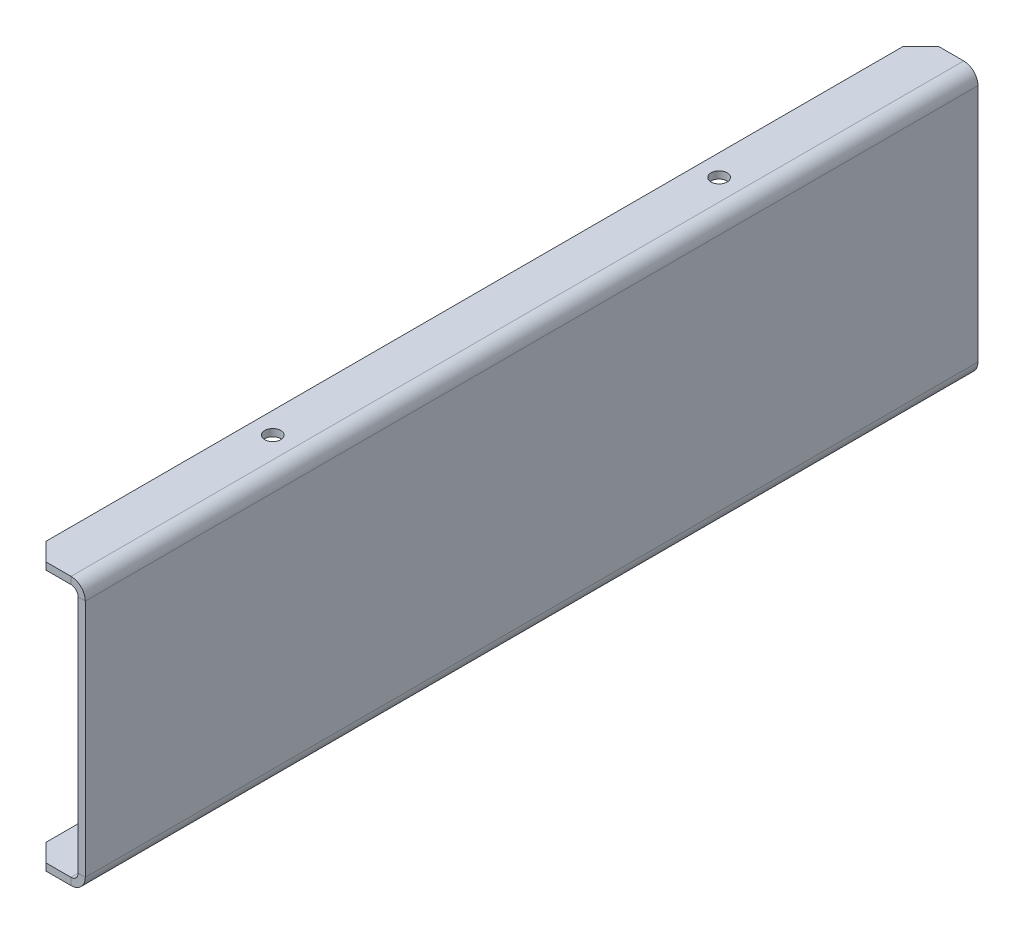
ISO-10303-21;
HEADER;
FILE_DESCRIPTION(('STEP AP214'),'2;1');
FILE_NAME('part.step','',(''),(''),'','','');
FILE_SCHEMA(('AUTOMOTIVE_DESIGN { 1 0 10303 214 1 1 1 1 }'));
ENDSEC;
DATA;
#1=APPLICATION_CONTEXT('core data for automotive mechanical design processes');
#2=APPLICATION_PROTOCOL_DEFINITION('international standard','automotive_design',2000,#1);
#3=PRODUCT_CONTEXT('',#1,'mechanical');
#4=PRODUCT('Part','Part','',(#3));
#5=PRODUCT_RELATED_PRODUCT_CATEGORY('part','',(#4));
#6=PRODUCT_DEFINITION_FORMATION('','',#4);
#7=PRODUCT_DEFINITION_CONTEXT('part definition',#1,'design');
#8=PRODUCT_DEFINITION('design','',#6,#7);
#9=PRODUCT_DEFINITION_SHAPE('','',#8);
#10=(LENGTH_UNIT() NAMED_UNIT(*) SI_UNIT(.MILLI.,.METRE.));
#11=(NAMED_UNIT(*) PLANE_ANGLE_UNIT() SI_UNIT($,.RADIAN.));
#12=(NAMED_UNIT(*) SI_UNIT($,.STERADIAN.) SOLID_ANGLE_UNIT());
#13=UNCERTAINTY_MEASURE_WITH_UNIT(LENGTH_MEASURE(1.E-05),#10,'distance_accuracy_value','');
#14=(GEOMETRIC_REPRESENTATION_CONTEXT(3) GLOBAL_UNCERTAINTY_ASSIGNED_CONTEXT((#13)) GLOBAL_UNIT_ASSIGNED_CONTEXT((#10,
#11,#12)) REPRESENTATION_CONTEXT('',''));
#15=CARTESIAN_POINT('',(0.,0.,0.));
#16=DIRECTION('',(0.,0.,1.));
#17=DIRECTION('',(1.,0.,0.));
#18=AXIS2_PLACEMENT_3D('',#15,#16,#17);
#19=CARTESIAN_POINT('',(0.,33.5,250.));
#20=DIRECTION('',(0.,0.,1.));
#21=DIRECTION('',(1.,0.,0.));
#22=AXIS2_PLACEMENT_3D('',#19,#20,#21);
#23=PLANE('',#22);
#24=DIRECTION('',(-1.,0.,0.));
#25=VECTOR('',#24,1.);
#26=CARTESIAN_POINT('',(0.,33.5,250.));
#27=LINE('',#26,#25);
#28=CARTESIAN_POINT('',(0.,33.5,250.));
#29=VERTEX_POINT('',#28);
#30=CARTESIAN_POINT('',(-1.99999999999999,33.5,250.));
#31=VERTEX_POINT('',#30);
#32=EDGE_CURVE('E271',#29,#31,#27,.T.);
#33=ORIENTED_EDGE('',*,*,#32,.F.);
#34=CARTESIAN_POINT('',(-3.99999999999999,33.5,250.));
#35=DIRECTION('',(0.,0.,1.));
#36=DIRECTION('',(1.,0.,0.));
#37=AXIS2_PLACEMENT_3D('',#34,#35,#36);
#38=CIRCLE('',#37,4.);
#39=CARTESIAN_POINT('',(-3.99999999999999,37.5,250.));
#40=VERTEX_POINT('',#39);
#41=EDGE_CURVE('E189',#40,#29,#38,.F.);
#42=ORIENTED_EDGE('',*,*,#41,.F.);
#43=DIRECTION('',(0.,1.,0.));
#44=VECTOR('',#43,1.);
#45=CARTESIAN_POINT('',(-3.99999999999999,35.5,250.));
#46=LINE('',#45,#44);
#47=CARTESIAN_POINT('',(-3.99999999999999,35.5,250.));
#48=VERTEX_POINT('',#47);
#49=EDGE_CURVE('E268',#48,#40,#46,.T.);
#50=ORIENTED_EDGE('',*,*,#49,.F.);
#51=CARTESIAN_POINT('',(-3.99999999999999,33.5,250.));
#52=DIRECTION('',(0.,0.,1.));
#53=DIRECTION('',(1.,0.,0.));
#54=AXIS2_PLACEMENT_3D('',#51,#52,#53);
#55=CIRCLE('',#54,2.);
#56=EDGE_CURVE('E199',#48,#31,#55,.F.);
#57=ORIENTED_EDGE('',*,*,#56,.T.);
#58=EDGE_LOOP('',(#33,#42,#50,#57));
#59=FACE_BOUND('',#58,.T.);
#60=ADVANCED_FACE('F34',(#59),#23,.T.);
#61=CARTESIAN_POINT('',(-3.99999999999999,35.5,250.));
#62=DIRECTION('',(0.,0.,1.));
#63=DIRECTION('',(1.,0.,0.));
#64=AXIS2_PLACEMENT_3D('',#61,#62,#63);
#65=PLANE('',#64);
#66=DIRECTION('',(0.,-1.,0.));
#67=VECTOR('',#66,1.);
#68=CARTESIAN_POINT('',(0.,37.5,250.));
#69=LINE('',#68,#67);
#70=CARTESIAN_POINT('',(0.,-33.5,250.));
#71=VERTEX_POINT('',#70);
#72=EDGE_CURVE('E187',#29,#71,#69,.T.);
#73=ORIENTED_EDGE('',*,*,#72,.F.);
#74=ORIENTED_EDGE('',*,*,#32,.T.);
#75=DIRECTION('',(0.,1.,0.));
#76=VECTOR('',#75,1.);
#77=CARTESIAN_POINT('',(-1.99999999999999,37.5,250.));
#78=LINE('',#77,#76);
#79=CARTESIAN_POINT('',(-1.99999999999999,-33.5,250.));
#80=VERTEX_POINT('',#79);
#81=EDGE_CURVE('E202',#31,#80,#78,.F.);
#82=ORIENTED_EDGE('',*,*,#81,.T.);
#83=DIRECTION('',(1.,0.,0.));
#84=VECTOR('',#83,1.);
#85=CARTESIAN_POINT('',(-1.99999999999999,-33.5,250.));
#86=LINE('',#85,#84);
#87=EDGE_CURVE('E161',#80,#71,#86,.T.);
#88=ORIENTED_EDGE('',*,*,#87,.T.);
#89=EDGE_LOOP('',(#73,#74,#82,#88));
#90=FACE_BOUND('',#89,.T.);
#91=ADVANCED_FACE('F338',(#90),#65,.T.);
#92=CARTESIAN_POINT('',(-3.99999999999999,37.5,0.));
#93=DIRECTION('',(0.,0.,-1.));
#94=DIRECTION('',(-1.,0.,0.));
#95=AXIS2_PLACEMENT_3D('',#92,#93,#94);
#96=PLANE('',#95);
#97=DIRECTION('',(0.,-1.,0.));
#98=VECTOR('',#97,1.);
#99=CARTESIAN_POINT('',(-3.99999999999999,37.5,0.));
#100=LINE('',#99,#98);
#101=CARTESIAN_POINT('',(-3.99999999999999,37.5,0.));
#102=VERTEX_POINT('',#101);
#103=CARTESIAN_POINT('',(-3.99999999999999,35.5,0.));
#104=VERTEX_POINT('',#103);
#105=EDGE_CURVE('E265',#102,#104,#100,.T.);
#106=ORIENTED_EDGE('',*,*,#105,.F.);
#107=CARTESIAN_POINT('',(-3.99999999999999,33.5,0.));
#108=DIRECTION('',(0.,0.,1.));
#109=DIRECTION('',(1.,0.,0.));
#110=AXIS2_PLACEMENT_3D('',#107,#108,#109);
#111=CIRCLE('',#110,4.);
#112=CARTESIAN_POINT('',(0.,33.5,0.));
#113=VERTEX_POINT('',#112);
#114=EDGE_CURVE('E217',#102,#113,#111,.F.);
#115=ORIENTED_EDGE('',*,*,#114,.T.);
#116=DIRECTION('',(1.,0.,0.));
#117=VECTOR('',#116,1.);
#118=CARTESIAN_POINT('',(-1.99999999999999,33.5,0.));
#119=LINE('',#118,#117);
#120=CARTESIAN_POINT('',(-1.99999999999999,33.5,0.));
#121=VERTEX_POINT('',#120);
#122=EDGE_CURVE('E160',#121,#113,#119,.T.);
#123=ORIENTED_EDGE('',*,*,#122,.F.);
#124=CARTESIAN_POINT('',(-3.99999999999999,33.5,0.));
#125=DIRECTION('',(0.,0.,1.));
#126=DIRECTION('',(1.,0.,0.));
#127=AXIS2_PLACEMENT_3D('',#124,#125,#126);
#128=CIRCLE('',#127,2.);
#129=EDGE_CURVE('E224',#104,#121,#128,.F.);
#130=ORIENTED_EDGE('',*,*,#129,.F.);
#131=EDGE_LOOP('',(#106,#115,#123,#130));
#132=FACE_BOUND('',#131,.T.);
#133=ADVANCED_FACE('F423',(#132),#96,.T.);
#134=CARTESIAN_POINT('',(-1.99999999999999,33.5,0.));
#135=DIRECTION('',(0.,0.,-1.));
#136=DIRECTION('',(-1.,0.,0.));
#137=AXIS2_PLACEMENT_3D('',#134,#135,#136);
#138=PLANE('',#137);
#139=DIRECTION('',(1.,0.,0.));
#140=VECTOR('',#139,1.);
#141=CARTESIAN_POINT('',(0.,35.5,0.));
#142=LINE('',#141,#140);
#143=CARTESIAN_POINT('',(-11.,35.5,0.));
#144=VERTEX_POINT('',#143);
#145=EDGE_CURVE('E222',#144,#104,#142,.T.);
#146=ORIENTED_EDGE('',*,*,#145,.F.);
#147=DIRECTION('',(0.,1.,0.));
#148=VECTOR('',#147,1.);
#149=CARTESIAN_POINT('',(-11.,33.5,0.));
#150=LINE('',#149,#148);
#151=CARTESIAN_POINT('',(-11.,37.5,0.));
#152=VERTEX_POINT('',#151);
#153=EDGE_CURVE('E289',#144,#152,#150,.T.);
#154=ORIENTED_EDGE('',*,*,#153,.T.);
#155=DIRECTION('',(1.,0.,0.));
#156=VECTOR('',#155,1.);
#157=CARTESIAN_POINT('',(0.,37.5,0.));
#158=LINE('',#157,#156);
#159=EDGE_CURVE('E220',#152,#102,#158,.T.);
#160=ORIENTED_EDGE('',*,*,#159,.T.);
#161=ORIENTED_EDGE('',*,*,#105,.T.);
#162=EDGE_LOOP('',(#146,#154,#160,#161));
#163=FACE_BOUND('',#162,.T.);
#164=ADVANCED_FACE('F311',(#163),#138,.T.);
#165=CARTESIAN_POINT('',(-3.99999999999999,-37.5,250.));
#166=DIRECTION('',(0.,0.,1.));
#167=DIRECTION('',(1.,0.,0.));
#168=AXIS2_PLACEMENT_3D('',#165,#166,#167);
#169=PLANE('',#168);
#170=DIRECTION('',(0.,1.,0.));
#171=VECTOR('',#170,1.);
#172=CARTESIAN_POINT('',(-3.99999999999999,-37.5,250.));
#173=LINE('',#172,#171);
#174=CARTESIAN_POINT('',(-3.99999999999999,-37.5,250.));
#175=VERTEX_POINT('',#174);
#176=CARTESIAN_POINT('',(-3.99999999999999,-35.5,250.));
#177=VERTEX_POINT('',#176);
#178=EDGE_CURVE('E148',#175,#177,#173,.T.);
#179=ORIENTED_EDGE('',*,*,#178,.F.);
#180=CARTESIAN_POINT('',(-3.99999999999999,-33.5,250.));
#181=DIRECTION('',(0.,0.,1.));
#182=DIRECTION('',(1.,0.,0.));
#183=AXIS2_PLACEMENT_3D('',#180,#181,#182);
#184=CIRCLE('',#183,4.);
#185=EDGE_CURVE('E152',#71,#175,#184,.F.);
#186=ORIENTED_EDGE('',*,*,#185,.F.);
#187=ORIENTED_EDGE('',*,*,#87,.F.);
#188=CARTESIAN_POINT('',(-3.99999999999999,-33.5,250.));
#189=DIRECTION('',(0.,0.,1.));
#190=DIRECTION('',(1.,0.,0.));
#191=AXIS2_PLACEMENT_3D('',#188,#189,#190);
#192=CIRCLE('',#191,2.);
#193=EDGE_CURVE('E155',#80,#177,#192,.F.);
#194=ORIENTED_EDGE('',*,*,#193,.T.);
#195=EDGE_LOOP('',(#179,#186,#187,#194));
#196=FACE_BOUND('',#195,.T.);
#197=ADVANCED_FACE('F150',(#196),#169,.T.);
#198=CARTESIAN_POINT('',(-1.99999999999999,-33.5,250.));
#199=DIRECTION('',(0.,0.,1.));
#200=DIRECTION('',(1.,0.,0.));
#201=AXIS2_PLACEMENT_3D('',#198,#199,#200);
#202=PLANE('',#201);
#203=DIRECTION('',(-1.,0.,0.));
#204=VECTOR('',#203,1.);
#205=CARTESIAN_POINT('',(0.,-35.5,250.));
#206=LINE('',#205,#204);
#207=CARTESIAN_POINT('',(-11.,-35.5,250.));
#208=VERTEX_POINT('',#207);
#209=EDGE_CURVE('E182',#177,#208,#206,.T.);
#210=ORIENTED_EDGE('',*,*,#209,.T.);
#211=DIRECTION('',(0.,-1.,0.));
#212=VECTOR('',#211,1.);
#213=CARTESIAN_POINT('',(-11.,-33.5,250.));
#214=LINE('',#213,#212);
#215=CARTESIAN_POINT('',(-11.,-37.5,250.));
#216=VERTEX_POINT('',#215);
#217=EDGE_CURVE('E42',#208,#216,#214,.T.);
#218=ORIENTED_EDGE('',*,*,#217,.T.);
#219=DIRECTION('',(-1.,0.,0.));
#220=VECTOR('',#219,1.);
#221=CARTESIAN_POINT('',(0.,-37.5,250.));
#222=LINE('',#221,#220);
#223=EDGE_CURVE('E170',#175,#216,#222,.T.);
#224=ORIENTED_EDGE('',*,*,#223,.F.);
#225=ORIENTED_EDGE('',*,*,#178,.T.);
#226=EDGE_LOOP('',(#210,#218,#224,#225));
#227=FACE_BOUND('',#226,.T.);
#228=ADVANCED_FACE('F180',(#227),#202,.T.);
#229=CARTESIAN_POINT('',(0.,-33.5,0.));
#230=DIRECTION('',(0.,0.,-1.));
#231=DIRECTION('',(-1.,0.,0.));
#232=AXIS2_PLACEMENT_3D('',#229,#230,#231);
#233=PLANE('',#232);
#234=DIRECTION('',(-1.,0.,0.));
#235=VECTOR('',#234,1.);
#236=CARTESIAN_POINT('',(0.,-33.5,0.));
#237=LINE('',#236,#235);
#238=CARTESIAN_POINT('',(0.,-33.5,0.));
#239=VERTEX_POINT('',#238);
#240=CARTESIAN_POINT('',(-1.99999999999999,-33.5,0.));
#241=VERTEX_POINT('',#240);
#242=EDGE_CURVE('E261',#239,#241,#237,.T.);
#243=ORIENTED_EDGE('',*,*,#242,.F.);
#244=CARTESIAN_POINT('',(-3.99999999999999,-33.5,0.));
#245=DIRECTION('',(0.,0.,1.));
#246=DIRECTION('',(1.,0.,0.));
#247=AXIS2_PLACEMENT_3D('',#244,#245,#246);
#248=CIRCLE('',#247,4.);
#249=CARTESIAN_POINT('',(-3.99999999999999,-37.5,0.));
#250=VERTEX_POINT('',#249);
#251=EDGE_CURVE('E212',#239,#250,#248,.F.);
#252=ORIENTED_EDGE('',*,*,#251,.T.);
#253=DIRECTION('',(0.,-1.,0.));
#254=VECTOR('',#253,1.);
#255=CARTESIAN_POINT('',(-3.99999999999999,-35.5,0.));
#256=LINE('',#255,#254);
#257=CARTESIAN_POINT('',(-3.99999999999999,-35.5,0.));
#258=VERTEX_POINT('',#257);
#259=EDGE_CURVE('E259',#258,#250,#256,.T.);
#260=ORIENTED_EDGE('',*,*,#259,.F.);
#261=CARTESIAN_POINT('',(-3.99999999999999,-33.5,0.));
#262=DIRECTION('',(0.,0.,1.));
#263=DIRECTION('',(1.,0.,0.));
#264=AXIS2_PLACEMENT_3D('',#261,#262,#263);
#265=CIRCLE('',#264,2.);
#266=EDGE_CURVE('E230',#241,#258,#265,.F.);
#267=ORIENTED_EDGE('',*,*,#266,.F.);
#268=EDGE_LOOP('',(#243,#252,#260,#267));
#269=FACE_BOUND('',#268,.T.);
#270=ADVANCED_FACE('F447',(#269),#233,.T.);
#271=CARTESIAN_POINT('',(-3.99999999999999,-35.5,0.));
#272=DIRECTION('',(0.,0.,-1.));
#273=DIRECTION('',(-1.,0.,0.));
#274=AXIS2_PLACEMENT_3D('',#271,#272,#273);
#275=PLANE('',#274);
#276=DIRECTION('',(0.,-1.,0.));
#277=VECTOR('',#276,1.);
#278=CARTESIAN_POINT('',(0.,37.5,0.));
#279=LINE('',#278,#277);
#280=EDGE_CURVE('E214',#113,#239,#279,.T.);
#281=ORIENTED_EDGE('',*,*,#280,.T.);
#282=ORIENTED_EDGE('',*,*,#242,.T.);
#283=DIRECTION('',(0.,1.,0.));
#284=VECTOR('',#283,1.);
#285=CARTESIAN_POINT('',(-1.99999999999999,37.5,0.));
#286=LINE('',#285,#284);
#287=EDGE_CURVE('E227',#121,#241,#286,.F.);
#288=ORIENTED_EDGE('',*,*,#287,.F.);
#289=ORIENTED_EDGE('',*,*,#122,.T.);
#290=EDGE_LOOP('',(#281,#282,#288,#289));
#291=FACE_BOUND('',#290,.T.);
#292=ADVANCED_FACE('F394',(#291),#275,.T.);
#293=CARTESIAN_POINT('',(0.,-35.5,250.));
#294=DIRECTION('',(0.,-1.,0.));
#295=DIRECTION('',(1.,0.,0.));
#296=AXIS2_PLACEMENT_3D('',#293,#294,#295);
#297=PLANE('',#296);
#298=CARTESIAN_POINT('',(-10.,-35.5,218.75));
#299=DIRECTION('',(0.,-1.,0.));
#300=DIRECTION('',(1.,0.,0.));
#301=AXIS2_PLACEMENT_3D('',#298,#299,#300);
#302=CIRCLE('',#301,2.25);
#303=CARTESIAN_POINT('',(-7.75,-35.5,218.75));
#304=VERTEX_POINT('',#303);
#305=EDGE_CURVE('E380',#304,#304,#302,.F.);
#306=ORIENTED_EDGE('',*,*,#305,.F.);
#307=EDGE_LOOP('',(#306));
#308=FACE_BOUND('',#307,.T.);
#309=CARTESIAN_POINT('',(-9.99999999999998,-35.5,156.25));
#310=DIRECTION('',(0.,-1.,0.));
#311=DIRECTION('',(1.,0.,0.));
#312=AXIS2_PLACEMENT_3D('',#309,#310,#311);
#313=CIRCLE('',#312,2.25);
#314=CARTESIAN_POINT('',(-7.74999999999998,-35.5,156.25));
#315=VERTEX_POINT('',#314);
#316=EDGE_CURVE('E374',#315,#315,#313,.F.);
#317=ORIENTED_EDGE('',*,*,#316,.F.);
#318=EDGE_LOOP('',(#317));
#319=FACE_BOUND('',#318,.T.);
#320=CARTESIAN_POINT('',(-9.99999999999997,-35.5,93.75));
#321=DIRECTION('',(0.,-1.,0.));
#322=DIRECTION('',(1.,0.,0.));
#323=AXIS2_PLACEMENT_3D('',#320,#321,#322);
#324=CIRCLE('',#323,2.25);
#325=CARTESIAN_POINT('',(-7.74999999999996,-35.5,93.75));
#326=VERTEX_POINT('',#325);
#327=EDGE_CURVE('E368',#326,#326,#324,.F.);
#328=ORIENTED_EDGE('',*,*,#327,.F.);
#329=EDGE_LOOP('',(#328));
#330=FACE_BOUND('',#329,.T.);
#331=CARTESIAN_POINT('',(-9.99999999999995,-35.5,31.25));
#332=DIRECTION('',(0.,-1.,0.));
#333=DIRECTION('',(1.,0.,0.));
#334=AXIS2_PLACEMENT_3D('',#331,#332,#333);
#335=CIRCLE('',#334,2.25);
#336=CARTESIAN_POINT('',(-7.74999999999995,-35.5,31.25));
#337=VERTEX_POINT('',#336);
#338=EDGE_CURVE('E364',#337,#337,#335,.F.);
#339=ORIENTED_EDGE('',*,*,#338,.F.);
#340=EDGE_LOOP('',(#339));
#341=FACE_BOUND('',#340,.T.);
#342=DIRECTION('',(-1.,0.,0.));
#343=VECTOR('',#342,1.);
#344=CARTESIAN_POINT('',(0.,-35.5,0.));
#345=LINE('',#344,#343);
#346=CARTESIAN_POINT('',(-11.,-35.5,0.));
#347=VERTEX_POINT('',#346);
#348=EDGE_CURVE('E207',#258,#347,#345,.T.);
#349=ORIENTED_EDGE('',*,*,#348,.T.);
#350=DIRECTION('',(-0.707106781186546,0.,0.707106781186549));
#351=VECTOR('',#350,1.);
#352=CARTESIAN_POINT('',(-11.,-35.5,0.));
#353=LINE('',#352,#351);
#354=CARTESIAN_POINT('',(-16.,-35.5,5.));
#355=VERTEX_POINT('',#354);
#356=EDGE_CURVE('E278',#347,#355,#353,.T.);
#357=ORIENTED_EDGE('',*,*,#356,.T.);
#358=DIRECTION('',(0.,0.,-1.));
#359=VECTOR('',#358,1.);
#360=CARTESIAN_POINT('',(-16.,-35.5,250.));
#361=LINE('',#360,#359);
#362=CARTESIAN_POINT('',(-16.,-35.5,245.));
#363=VERTEX_POINT('',#362);
#364=EDGE_CURVE('E256',#363,#355,#361,.T.);
#365=ORIENTED_EDGE('',*,*,#364,.F.);
#366=DIRECTION('',(-0.707106781186551,0.,-0.707106781186544));
#367=VECTOR('',#366,1.);
#368=CARTESIAN_POINT('',(-16.,-35.5,245.));
#369=LINE('',#368,#367);
#370=EDGE_CURVE('E276',#363,#208,#369,.F.);
#371=ORIENTED_EDGE('',*,*,#370,.T.);
#372=ORIENTED_EDGE('',*,*,#209,.F.);
#373=DIRECTION('',(0.,0.,-1.));
#374=VECTOR('',#373,1.);
#375=CARTESIAN_POINT('',(-3.99999999999999,-35.5,250.));
#376=LINE('',#375,#374);
#377=EDGE_CURVE('E206',#177,#258,#376,.T.);
#378=ORIENTED_EDGE('',*,*,#377,.T.);
#379=EDGE_LOOP('',(#349,#357,#365,#371,#372,#378));
#380=FACE_BOUND('',#379,.T.);
#381=ADVANCED_FACE('F350',(#308,#319,#330,#341,#380),#297,.F.);
#382=CARTESIAN_POINT('',(-16.,-37.5,250.));
#383=DIRECTION('',(-1.,0.,0.));
#384=DIRECTION('',(0.,-1.,0.));
#385=AXIS2_PLACEMENT_3D('',#382,#383,#384);
#386=PLANE('',#385);
#387=ORIENTED_EDGE('',*,*,#364,.T.);
#388=DIRECTION('',(0.,-1.,0.));
#389=VECTOR('',#388,1.);
#390=CARTESIAN_POINT('',(-16.,-37.5,5.));
#391=LINE('',#390,#389);
#392=CARTESIAN_POINT('',(-16.,-37.5,5.00000000000001));
#393=VERTEX_POINT('',#392);
#394=EDGE_CURVE('E283',#355,#393,#391,.T.);
#395=ORIENTED_EDGE('',*,*,#394,.T.);
#396=DIRECTION('',(0.,0.,-1.));
#397=VECTOR('',#396,1.);
#398=CARTESIAN_POINT('',(-16.,-37.5,250.));
#399=LINE('',#398,#397);
#400=CARTESIAN_POINT('',(-16.,-37.5,245.));
#401=VERTEX_POINT('',#400);
#402=EDGE_CURVE('E177',#401,#393,#399,.T.);
#403=ORIENTED_EDGE('',*,*,#402,.F.);
#404=DIRECTION('',(0.,1.,0.));
#405=VECTOR('',#404,1.);
#406=CARTESIAN_POINT('',(-16.,-37.5,245.));
#407=LINE('',#406,#405);
#408=EDGE_CURVE('E280',#401,#363,#407,.T.);
#409=ORIENTED_EDGE('',*,*,#408,.T.);
#410=EDGE_LOOP('',(#387,#395,#403,#409));
#411=FACE_BOUND('',#410,.T.);
#412=ADVANCED_FACE('F393',(#411),#386,.T.);
#413=CARTESIAN_POINT('',(0.,-37.5,250.));
#414=DIRECTION('',(0.,-1.,0.));
#415=DIRECTION('',(1.,0.,0.));
#416=AXIS2_PLACEMENT_3D('',#413,#414,#415);
#417=PLANE('',#416);
#418=CARTESIAN_POINT('',(-10.,-37.5,218.75));
#419=DIRECTION('',(0.,-1.,0.));
#420=DIRECTION('',(0.,0.,-1.));
#421=AXIS2_PLACEMENT_3D('',#418,#419,#420);
#422=CIRCLE('',#421,2.25);
#423=CARTESIAN_POINT('',(-10.,-37.5,216.5));
#424=VERTEX_POINT('',#423);
#425=EDGE_CURVE('E383',#424,#424,#422,.T.);
#426=ORIENTED_EDGE('',*,*,#425,.F.);
#427=EDGE_LOOP('',(#426));
#428=FACE_BOUND('',#427,.T.);
#429=CARTESIAN_POINT('',(-9.99999999999998,-37.5,156.25));
#430=DIRECTION('',(0.,-1.,0.));
#431=DIRECTION('',(0.,0.,-1.));
#432=AXIS2_PLACEMENT_3D('',#429,#430,#431);
#433=CIRCLE('',#432,2.25);
#434=CARTESIAN_POINT('',(-9.99999999999998,-37.5,154.));
#435=VERTEX_POINT('',#434);
#436=EDGE_CURVE('E377',#435,#435,#433,.T.);
#437=ORIENTED_EDGE('',*,*,#436,.F.);
#438=EDGE_LOOP('',(#437));
#439=FACE_BOUND('',#438,.T.);
#440=CARTESIAN_POINT('',(-9.99999999999997,-37.5,93.75));
#441=DIRECTION('',(0.,-1.,0.));
#442=DIRECTION('',(0.,0.,-1.));
#443=AXIS2_PLACEMENT_3D('',#440,#441,#442);
#444=CIRCLE('',#443,2.25);
#445=CARTESIAN_POINT('',(-9.99999999999997,-37.5,91.5));
#446=VERTEX_POINT('',#445);
#447=EDGE_CURVE('E371',#446,#446,#444,.T.);
#448=ORIENTED_EDGE('',*,*,#447,.F.);
#449=EDGE_LOOP('',(#448));
#450=FACE_BOUND('',#449,.T.);
#451=CARTESIAN_POINT('',(-9.99999999999995,-37.5,31.25));
#452=DIRECTION('',(0.,-1.,0.));
#453=DIRECTION('',(0.,0.,-1.));
#454=AXIS2_PLACEMENT_3D('',#451,#452,#453);
#455=CIRCLE('',#454,2.25);
#456=CARTESIAN_POINT('',(-9.99999999999995,-37.5,29.));
#457=VERTEX_POINT('',#456);
#458=EDGE_CURVE('E365',#457,#457,#455,.T.);
#459=ORIENTED_EDGE('',*,*,#458,.F.);
#460=EDGE_LOOP('',(#459));
#461=FACE_BOUND('',#460,.T.);
#462=ORIENTED_EDGE('',*,*,#402,.T.);
#463=DIRECTION('',(0.707106781186546,0.,-0.707106781186549));
#464=VECTOR('',#463,1.);
#465=CARTESIAN_POINT('',(-130.5,-37.5000000000001,119.500000000001));
#466=LINE('',#465,#464);
#467=CARTESIAN_POINT('',(-11.,-37.5,0.));
#468=VERTEX_POINT('',#467);
#469=EDGE_CURVE('E287',#393,#468,#466,.T.);
#470=ORIENTED_EDGE('',*,*,#469,.T.);
#471=DIRECTION('',(-1.,0.,0.));
#472=VECTOR('',#471,1.);
#473=CARTESIAN_POINT('',(0.,-37.5,0.));
#474=LINE('',#473,#472);
#475=EDGE_CURVE('E173',#250,#468,#474,.T.);
#476=ORIENTED_EDGE('',*,*,#475,.F.);
#477=DIRECTION('',(0.,0.,-1.));
#478=VECTOR('',#477,1.);
#479=CARTESIAN_POINT('',(-3.99999999999999,-37.5,250.));
#480=LINE('',#479,#478);
#481=EDGE_CURVE('E167',#175,#250,#480,.T.);
#482=ORIENTED_EDGE('',*,*,#481,.F.);
#483=ORIENTED_EDGE('',*,*,#223,.T.);
#484=DIRECTION('',(0.707106781186551,0.,0.707106781186544));
#485=VECTOR('',#484,1.);
#486=CARTESIAN_POINT('',(-5.49999999999993,-37.5,255.5));
#487=LINE('',#486,#485);
#488=EDGE_CURVE('E285',#216,#401,#487,.F.);
#489=ORIENTED_EDGE('',*,*,#488,.T.);
#490=EDGE_LOOP('',(#462,#470,#476,#482,#483,#489));
#491=FACE_BOUND('',#490,.T.);
#492=ADVANCED_FACE('F169',(#428,#439,#450,#461,#491),#417,.T.);
#493=CARTESIAN_POINT('',(-3.99999999999999,-33.5,250.));
#494=DIRECTION('',(0.,0.,-1.));
#495=DIRECTION('',(-1.,0.,0.));
#496=AXIS2_PLACEMENT_3D('',#493,#494,#495);
#497=CYLINDRICAL_SURFACE('',#496,4.);
#498=ORIENTED_EDGE('',*,*,#251,.F.);
#499=DIRECTION('',(0.,0.,-1.));
#500=VECTOR('',#499,1.);
#501=CARTESIAN_POINT('',(0.,-33.5,250.));
#502=LINE('',#501,#500);
#503=EDGE_CURVE('E178',#71,#239,#502,.T.);
#504=ORIENTED_EDGE('',*,*,#503,.F.);
#505=ORIENTED_EDGE('',*,*,#185,.T.);
#506=ORIENTED_EDGE('',*,*,#481,.T.);
#507=EDGE_LOOP('',(#498,#504,#505,#506));
#508=FACE_BOUND('',#507,.T.);
#509=ADVANCED_FACE('F185',(#508),#497,.T.);
#510=CARTESIAN_POINT('',(0.,37.5,250.));
#511=DIRECTION('',(1.,0.,0.));
#512=DIRECTION('',(0.,0.,-1.));
#513=AXIS2_PLACEMENT_3D('',#510,#511,#512);
#514=PLANE('',#513);
#515=ORIENTED_EDGE('',*,*,#280,.F.);
#516=DIRECTION('',(0.,0.,-1.));
#517=VECTOR('',#516,1.);
#518=CARTESIAN_POINT('',(0.,33.5,250.));
#519=LINE('',#518,#517);
#520=EDGE_CURVE('E251',#29,#113,#519,.T.);
#521=ORIENTED_EDGE('',*,*,#520,.F.);
#522=ORIENTED_EDGE('',*,*,#72,.T.);
#523=ORIENTED_EDGE('',*,*,#503,.T.);
#524=EDGE_LOOP('',(#515,#521,#522,#523));
#525=FACE_BOUND('',#524,.T.);
#526=ADVANCED_FACE('F337',(#525),#514,.T.);
#527=CARTESIAN_POINT('',(-3.99999999999999,33.5,250.));
#528=DIRECTION('',(0.,0.,-1.));
#529=DIRECTION('',(-1.,0.,0.));
#530=AXIS2_PLACEMENT_3D('',#527,#528,#529);
#531=CYLINDRICAL_SURFACE('',#530,4.);
#532=ORIENTED_EDGE('',*,*,#114,.F.);
#533=DIRECTION('',(0.,0.,-1.));
#534=VECTOR('',#533,1.);
#535=CARTESIAN_POINT('',(-3.99999999999999,37.5,250.));
#536=LINE('',#535,#534);
#537=EDGE_CURVE('E248',#40,#102,#536,.T.);
#538=ORIENTED_EDGE('',*,*,#537,.F.);
#539=ORIENTED_EDGE('',*,*,#41,.T.);
#540=ORIENTED_EDGE('',*,*,#520,.T.);
#541=EDGE_LOOP('',(#532,#538,#539,#540));
#542=FACE_BOUND('',#541,.T.);
#543=ADVANCED_FACE('F329',(#542),#531,.T.);
#544=CARTESIAN_POINT('',(0.,37.5,250.));
#545=DIRECTION('',(0.,1.,0.));
#546=DIRECTION('',(-1.,0.,0.));
#547=AXIS2_PLACEMENT_3D('',#544,#545,#546);
#548=PLANE('',#547);
#549=CARTESIAN_POINT('',(-9.99999999999969,37.5,187.5));
#550=DIRECTION('',(0.,1.,0.));
#551=DIRECTION('',(0.,0.,-1.));
#552=AXIS2_PLACEMENT_3D('',#549,#550,#551);
#553=CIRCLE('',#552,2.25);
#554=CARTESIAN_POINT('',(-9.99999999999969,37.5,185.25));
#555=VERTEX_POINT('',#554);
#556=EDGE_CURVE('E361',#555,#555,#553,.T.);
#557=ORIENTED_EDGE('',*,*,#556,.F.);
#558=EDGE_LOOP('',(#557));
#559=FACE_BOUND('',#558,.T.);
#560=CARTESIAN_POINT('',(-9.99999999999998,37.5,62.5));
#561=DIRECTION('',(0.,1.,0.));
#562=DIRECTION('',(0.,0.,1.));
#563=AXIS2_PLACEMENT_3D('',#560,#561,#562);
#564=CIRCLE('',#563,2.25);
#565=CARTESIAN_POINT('',(-9.99999999999998,37.5,64.75));
#566=VERTEX_POINT('',#565);
#567=EDGE_CURVE('E355',#566,#566,#564,.T.);
#568=ORIENTED_EDGE('',*,*,#567,.F.);
#569=EDGE_LOOP('',(#568));
#570=FACE_BOUND('',#569,.T.);
#571=ORIENTED_EDGE('',*,*,#159,.F.);
#572=DIRECTION('',(0.707106781186546,0.,-0.707106781186549));
#573=VECTOR('',#572,1.);
#574=CARTESIAN_POINT('',(-130.5,37.5000000000001,119.500000000001));
#575=LINE('',#574,#573);
#576=CARTESIAN_POINT('',(-16.,37.5,5.));
#577=VERTEX_POINT('',#576);
#578=EDGE_CURVE('E294',#152,#577,#575,.F.);
#579=ORIENTED_EDGE('',*,*,#578,.T.);
#580=DIRECTION('',(0.,0.,-1.));
#581=VECTOR('',#580,1.);
#582=CARTESIAN_POINT('',(-16.,37.5,250.));
#583=LINE('',#582,#581);
#584=CARTESIAN_POINT('',(-16.,37.5,245.));
#585=VERTEX_POINT('',#584);
#586=EDGE_CURVE('E246',#585,#577,#583,.T.);
#587=ORIENTED_EDGE('',*,*,#586,.F.);
#588=DIRECTION('',(-0.707106781186551,0.,-0.707106781186544));
#589=VECTOR('',#588,1.);
#590=CARTESIAN_POINT('',(-5.49999999999993,37.5,255.5));
#591=LINE('',#590,#589);
#592=CARTESIAN_POINT('',(-11.,37.5,250.));
#593=VERTEX_POINT('',#592);
#594=EDGE_CURVE('E292',#585,#593,#591,.F.);
#595=ORIENTED_EDGE('',*,*,#594,.T.);
#596=DIRECTION('',(1.,0.,0.));
#597=VECTOR('',#596,1.);
#598=CARTESIAN_POINT('',(0.,37.5,250.));
#599=LINE('',#598,#597);
#600=EDGE_CURVE('E195',#593,#40,#599,.T.);
#601=ORIENTED_EDGE('',*,*,#600,.T.);
#602=ORIENTED_EDGE('',*,*,#537,.T.);
#603=EDGE_LOOP('',(#571,#579,#587,#595,#601,#602));
#604=FACE_BOUND('',#603,.T.);
#605=ADVANCED_FACE('F317',(#559,#570,#604),#548,.T.);
#606=CARTESIAN_POINT('',(-16.,35.5,250.));
#607=DIRECTION('',(-1.,0.,0.));
#608=DIRECTION('',(0.,-1.,0.));
#609=AXIS2_PLACEMENT_3D('',#606,#607,#608);
#610=PLANE('',#609);
#611=ORIENTED_EDGE('',*,*,#586,.T.);
#612=DIRECTION('',(0.,-1.,0.));
#613=VECTOR('',#612,1.);
#614=CARTESIAN_POINT('',(-16.,35.5,5.));
#615=LINE('',#614,#613);
#616=CARTESIAN_POINT('',(-16.,35.5,4.99999999999998));
#617=VERTEX_POINT('',#616);
#618=EDGE_CURVE('E55',#577,#617,#615,.T.);
#619=ORIENTED_EDGE('',*,*,#618,.T.);
#620=DIRECTION('',(0.,0.,-1.));
#621=VECTOR('',#620,1.);
#622=CARTESIAN_POINT('',(-16.,35.5,250.));
#623=LINE('',#622,#621);
#624=CARTESIAN_POINT('',(-16.,35.5,245.));
#625=VERTEX_POINT('',#624);
#626=EDGE_CURVE('E244',#625,#617,#623,.T.);
#627=ORIENTED_EDGE('',*,*,#626,.F.);
#628=DIRECTION('',(0.,1.,0.));
#629=VECTOR('',#628,1.);
#630=CARTESIAN_POINT('',(-16.,35.5,245.));
#631=LINE('',#630,#629);
#632=EDGE_CURVE('E296',#625,#585,#631,.T.);
#633=ORIENTED_EDGE('',*,*,#632,.T.);
#634=EDGE_LOOP('',(#611,#619,#627,#633));
#635=FACE_BOUND('',#634,.T.);
#636=ADVANCED_FACE('F318',(#635),#610,.T.);
#637=CARTESIAN_POINT('',(0.,35.5,250.));
#638=DIRECTION('',(0.,1.,0.));
#639=DIRECTION('',(-1.,0.,0.));
#640=AXIS2_PLACEMENT_3D('',#637,#638,#639);
#641=PLANE('',#640);
#642=CARTESIAN_POINT('',(-9.99999999999969,35.5,187.5));
#643=DIRECTION('',(0.,1.,0.));
#644=DIRECTION('',(-1.,0.,0.));
#645=AXIS2_PLACEMENT_3D('',#642,#643,#644);
#646=CIRCLE('',#645,2.25);
#647=CARTESIAN_POINT('',(-12.2499999999997,35.5,187.5));
#648=VERTEX_POINT('',#647);
#649=EDGE_CURVE('E358',#648,#648,#646,.F.);
#650=ORIENTED_EDGE('',*,*,#649,.F.);
#651=EDGE_LOOP('',(#650));
#652=FACE_BOUND('',#651,.T.);
#653=CARTESIAN_POINT('',(-9.99999999999998,35.5,62.5));
#654=DIRECTION('',(0.,1.,0.));
#655=DIRECTION('',(-1.,0.,0.));
#656=AXIS2_PLACEMENT_3D('',#653,#654,#655);
#657=CIRCLE('',#656,2.25);
#658=CARTESIAN_POINT('',(-12.25,35.5,62.5));
#659=VERTEX_POINT('',#658);
#660=EDGE_CURVE('E210',#659,#659,#657,.F.);
#661=ORIENTED_EDGE('',*,*,#660,.F.);
#662=EDGE_LOOP('',(#661));
#663=FACE_BOUND('',#662,.T.);
#664=ORIENTED_EDGE('',*,*,#626,.T.);
#665=DIRECTION('',(-0.707106781186546,0.,0.707106781186549));
#666=VECTOR('',#665,1.);
#667=CARTESIAN_POINT('',(-11.,35.5,0.));
#668=LINE('',#667,#666);
#669=EDGE_CURVE('E302',#617,#144,#668,.F.);
#670=ORIENTED_EDGE('',*,*,#669,.T.);
#671=ORIENTED_EDGE('',*,*,#145,.T.);
#672=DIRECTION('',(0.,0.,-1.));
#673=VECTOR('',#672,1.);
#674=CARTESIAN_POINT('',(-3.99999999999999,35.5,250.));
#675=LINE('',#674,#673);
#676=EDGE_CURVE('E241',#48,#104,#675,.T.);
#677=ORIENTED_EDGE('',*,*,#676,.F.);
#678=DIRECTION('',(1.,0.,0.));
#679=VECTOR('',#678,1.);
#680=CARTESIAN_POINT('',(0.,35.5,250.));
#681=LINE('',#680,#679);
#682=CARTESIAN_POINT('',(-11.,35.5,250.));
#683=VERTEX_POINT('',#682);
#684=EDGE_CURVE('E197',#683,#48,#681,.T.);
#685=ORIENTED_EDGE('',*,*,#684,.F.);
#686=DIRECTION('',(0.707106781186551,0.,0.707106781186544));
#687=VECTOR('',#686,1.);
#688=CARTESIAN_POINT('',(-16.,35.5,245.));
#689=LINE('',#688,#687);
#690=EDGE_CURVE('E300',#683,#625,#689,.F.);
#691=ORIENTED_EDGE('',*,*,#690,.T.);
#692=EDGE_LOOP('',(#664,#670,#671,#677,#685,#691));
#693=FACE_BOUND('',#692,.T.);
#694=ADVANCED_FACE('F306',(#652,#663,#693),#641,.F.);
#695=CARTESIAN_POINT('',(-3.99999999999999,33.5,250.));
#696=DIRECTION('',(0.,0.,-1.));
#697=DIRECTION('',(-1.,0.,0.));
#698=AXIS2_PLACEMENT_3D('',#695,#696,#697);
#699=CYLINDRICAL_SURFACE('',#698,2.);
#700=ORIENTED_EDGE('',*,*,#129,.T.);
#701=DIRECTION('',(0.,0.,-1.));
#702=VECTOR('',#701,1.);
#703=CARTESIAN_POINT('',(-1.99999999999999,33.5,250.));
#704=LINE('',#703,#702);
#705=EDGE_CURVE('E238',#31,#121,#704,.T.);
#706=ORIENTED_EDGE('',*,*,#705,.F.);
#707=ORIENTED_EDGE('',*,*,#56,.F.);
#708=ORIENTED_EDGE('',*,*,#676,.T.);
#709=EDGE_LOOP('',(#700,#706,#707,#708));
#710=FACE_BOUND('',#709,.T.);
#711=ADVANCED_FACE('F452',(#710),#699,.F.);
#712=CARTESIAN_POINT('',(-1.99999999999999,37.5,250.));
#713=DIRECTION('',(1.,0.,0.));
#714=DIRECTION('',(0.,0.,-1.));
#715=AXIS2_PLACEMENT_3D('',#712,#713,#714);
#716=PLANE('',#715);
#717=ORIENTED_EDGE('',*,*,#287,.T.);
#718=DIRECTION('',(0.,0.,-1.));
#719=VECTOR('',#718,1.);
#720=CARTESIAN_POINT('',(-1.99999999999999,-33.5,250.));
#721=LINE('',#720,#719);
#722=EDGE_CURVE('E235',#80,#241,#721,.T.);
#723=ORIENTED_EDGE('',*,*,#722,.F.);
#724=ORIENTED_EDGE('',*,*,#81,.F.);
#725=ORIENTED_EDGE('',*,*,#705,.T.);
#726=EDGE_LOOP('',(#717,#723,#724,#725));
#727=FACE_BOUND('',#726,.T.);
#728=ADVANCED_FACE('F342',(#727),#716,.F.);
#729=CARTESIAN_POINT('',(-3.99999999999999,-33.5,250.));
#730=DIRECTION('',(0.,0.,-1.));
#731=DIRECTION('',(-1.,0.,0.));
#732=AXIS2_PLACEMENT_3D('',#729,#730,#731);
#733=CYLINDRICAL_SURFACE('',#732,2.);
#734=ORIENTED_EDGE('',*,*,#266,.T.);
#735=ORIENTED_EDGE('',*,*,#377,.F.);
#736=ORIENTED_EDGE('',*,*,#193,.F.);
#737=ORIENTED_EDGE('',*,*,#722,.T.);
#738=EDGE_LOOP('',(#734,#735,#736,#737));
#739=FACE_BOUND('',#738,.T.);
#740=ADVANCED_FACE('F346',(#739),#733,.F.);
#741=CARTESIAN_POINT('',(-3.99999999999999,-33.5,250.));
#742=DIRECTION('',(0.,0.,1.));
#743=DIRECTION('',(1.,0.,0.));
#744=AXIS2_PLACEMENT_3D('',#741,#742,#743);
#745=PLANE('',#744);
#746=ORIENTED_EDGE('',*,*,#600,.F.);
#747=DIRECTION('',(0.,-1.,0.));
#748=VECTOR('',#747,1.);
#749=CARTESIAN_POINT('',(-11.0000000000001,-33.5,250.));
#750=LINE('',#749,#748);
#751=EDGE_CURVE('E11',#593,#683,#750,.T.);
#752=ORIENTED_EDGE('',*,*,#751,.T.);
#753=ORIENTED_EDGE('',*,*,#684,.T.);
#754=ORIENTED_EDGE('',*,*,#49,.T.);
#755=EDGE_LOOP('',(#746,#752,#753,#754));
#756=FACE_BOUND('',#755,.T.);
#757=ADVANCED_FACE('F322',(#756),#745,.T.);
#758=CARTESIAN_POINT('',(-3.99999999999999,-33.5,0.));
#759=DIRECTION('',(0.,0.,1.));
#760=DIRECTION('',(1.,0.,0.));
#761=AXIS2_PLACEMENT_3D('',#758,#759,#760);
#762=PLANE('',#761);
#763=ORIENTED_EDGE('',*,*,#475,.T.);
#764=DIRECTION('',(0.,1.,0.));
#765=VECTOR('',#764,1.);
#766=CARTESIAN_POINT('',(-11.,-35.5,0.));
#767=LINE('',#766,#765);
#768=EDGE_CURVE('E273',#468,#347,#767,.T.);
#769=ORIENTED_EDGE('',*,*,#768,.T.);
#770=ORIENTED_EDGE('',*,*,#348,.F.);
#771=ORIENTED_EDGE('',*,*,#259,.T.);
#772=EDGE_LOOP('',(#763,#769,#770,#771));
#773=FACE_BOUND('',#772,.T.);
#774=ADVANCED_FACE('F430',(#773),#762,.F.);
#775=CARTESIAN_POINT('',(-11.,-33.5,0.));
#776=DIRECTION('',(-0.707106781186549,0.,-0.707106781186546));
#777=DIRECTION('',(-0.707106781186546,0.,0.707106781186549));
#778=AXIS2_PLACEMENT_3D('',#775,#776,#777);
#779=PLANE('',#778);
#780=ORIENTED_EDGE('',*,*,#469,.F.);
#781=ORIENTED_EDGE('',*,*,#394,.F.);
#782=ORIENTED_EDGE('',*,*,#356,.F.);
#783=ORIENTED_EDGE('',*,*,#768,.F.);
#784=EDGE_LOOP('',(#780,#781,#782,#783));
#785=FACE_BOUND('',#784,.T.);
#786=ADVANCED_FACE('F427',(#785),#779,.T.);
#787=CARTESIAN_POINT('',(-11.,33.5,0.));
#788=DIRECTION('',(0.707106781186549,0.,0.707106781186546));
#789=DIRECTION('',(0.707106781186546,0.,-0.707106781186549));
#790=AXIS2_PLACEMENT_3D('',#787,#788,#789);
#791=PLANE('',#790);
#792=ORIENTED_EDGE('',*,*,#669,.F.);
#793=ORIENTED_EDGE('',*,*,#618,.F.);
#794=ORIENTED_EDGE('',*,*,#578,.F.);
#795=ORIENTED_EDGE('',*,*,#153,.F.);
#796=EDGE_LOOP('',(#792,#793,#794,#795));
#797=FACE_BOUND('',#796,.T.);
#798=ADVANCED_FACE('F314',(#797),#791,.F.);
#799=CARTESIAN_POINT('',(-16.,-37.5,245.));
#800=DIRECTION('',(0.707106781186544,0.,-0.707106781186551));
#801=DIRECTION('',(-0.707106781186551,0.,-0.707106781186544));
#802=AXIS2_PLACEMENT_3D('',#799,#800,#801);
#803=PLANE('',#802);
#804=ORIENTED_EDGE('',*,*,#488,.F.);
#805=ORIENTED_EDGE('',*,*,#217,.F.);
#806=ORIENTED_EDGE('',*,*,#370,.F.);
#807=ORIENTED_EDGE('',*,*,#408,.F.);
#808=EDGE_LOOP('',(#804,#805,#806,#807));
#809=FACE_BOUND('',#808,.T.);
#810=ADVANCED_FACE('F433',(#809),#803,.F.);
#811=CARTESIAN_POINT('',(-16.,35.5,245.));
#812=DIRECTION('',(0.707106781186544,0.,-0.707106781186551));
#813=DIRECTION('',(-0.707106781186551,0.,-0.707106781186544));
#814=AXIS2_PLACEMENT_3D('',#811,#812,#813);
#815=PLANE('',#814);
#816=ORIENTED_EDGE('',*,*,#690,.F.);
#817=ORIENTED_EDGE('',*,*,#751,.F.);
#818=ORIENTED_EDGE('',*,*,#594,.F.);
#819=ORIENTED_EDGE('',*,*,#632,.F.);
#820=EDGE_LOOP('',(#816,#817,#818,#819));
#821=FACE_BOUND('',#820,.T.);
#822=ADVANCED_FACE('F36',(#821),#815,.F.);
#823=CARTESIAN_POINT('',(-9.99999999999998,-37.501,62.5));
#824=DIRECTION('',(0.,1.,0.));
#825=DIRECTION('',(0.,0.,1.));
#826=AXIS2_PLACEMENT_3D('',#823,#824,#825);
#827=CYLINDRICAL_SURFACE('',#826,2.25);
#828=ORIENTED_EDGE('',*,*,#567,.T.);
#829=EDGE_LOOP('',(#828));
#830=FACE_BOUND('',#829,.T.);
#831=ORIENTED_EDGE('',*,*,#660,.T.);
#832=EDGE_LOOP('',(#831));
#833=FACE_BOUND('',#832,.T.);
#834=ADVANCED_FACE('F415',(#830,#833),#827,.F.);
#835=CARTESIAN_POINT('',(-9.99999999999969,-37.501,187.5));
#836=DIRECTION('',(0.,1.,0.));
#837=DIRECTION('',(0.,0.,1.));
#838=AXIS2_PLACEMENT_3D('',#835,#836,#837);
#839=CYLINDRICAL_SURFACE('',#838,2.25);
#840=ORIENTED_EDGE('',*,*,#556,.T.);
#841=EDGE_LOOP('',(#840));
#842=FACE_BOUND('',#841,.T.);
#843=ORIENTED_EDGE('',*,*,#649,.T.);
#844=EDGE_LOOP('',(#843));
#845=FACE_BOUND('',#844,.T.);
#846=ADVANCED_FACE('F405',(#842,#845),#839,.F.);
#847=CARTESIAN_POINT('',(-9.99999999999995,37.501,31.25));
#848=DIRECTION('',(0.,-1.,0.));
#849=DIRECTION('',(0.,0.,-1.));
#850=AXIS2_PLACEMENT_3D('',#847,#848,#849);
#851=CYLINDRICAL_SURFACE('',#850,2.25);
#852=ORIENTED_EDGE('',*,*,#458,.T.);
#853=EDGE_LOOP('',(#852));
#854=FACE_BOUND('',#853,.T.);
#855=ORIENTED_EDGE('',*,*,#338,.T.);
#856=EDGE_LOOP('',(#855));
#857=FACE_BOUND('',#856,.T.);
#858=ADVANCED_FACE('F402',(#854,#857),#851,.F.);
#859=CARTESIAN_POINT('',(-9.99999999999997,37.501,93.75));
#860=DIRECTION('',(0.,-1.,0.));
#861=DIRECTION('',(0.,0.,-1.));
#862=AXIS2_PLACEMENT_3D('',#859,#860,#861);
#863=CYLINDRICAL_SURFACE('',#862,2.25);
#864=ORIENTED_EDGE('',*,*,#447,.T.);
#865=EDGE_LOOP('',(#864));
#866=FACE_BOUND('',#865,.T.);
#867=ORIENTED_EDGE('',*,*,#327,.T.);
#868=EDGE_LOOP('',(#867));
#869=FACE_BOUND('',#868,.T.);
#870=ADVANCED_FACE('F404',(#866,#869),#863,.F.);
#871=CARTESIAN_POINT('',(-9.99999999999998,37.501,156.25));
#872=DIRECTION('',(0.,-1.,0.));
#873=DIRECTION('',(0.,0.,-1.));
#874=AXIS2_PLACEMENT_3D('',#871,#872,#873);
#875=CYLINDRICAL_SURFACE('',#874,2.25);
#876=ORIENTED_EDGE('',*,*,#436,.T.);
#877=EDGE_LOOP('',(#876));
#878=FACE_BOUND('',#877,.T.);
#879=ORIENTED_EDGE('',*,*,#316,.T.);
#880=EDGE_LOOP('',(#879));
#881=FACE_BOUND('',#880,.T.);
#882=ADVANCED_FACE('F412',(#878,#881),#875,.F.);
#883=CARTESIAN_POINT('',(-10.,37.501,218.75));
#884=DIRECTION('',(0.,-1.,0.));
#885=DIRECTION('',(0.,0.,-1.));
#886=AXIS2_PLACEMENT_3D('',#883,#884,#885);
#887=CYLINDRICAL_SURFACE('',#886,2.25);
#888=ORIENTED_EDGE('',*,*,#425,.T.);
#889=EDGE_LOOP('',(#888));
#890=FACE_BOUND('',#889,.T.);
#891=ORIENTED_EDGE('',*,*,#305,.T.);
#892=EDGE_LOOP('',(#891));
#893=FACE_BOUND('',#892,.T.);
#894=ADVANCED_FACE('F389',(#890,#893),#887,.F.);
#895=CLOSED_SHELL('',(#60,#91,#133,#164,#197,#228,#270,#292,#381,#412,#492,#509,#526,#543,#605,
#636,#694,#711,#728,#740,#757,#774,#786,#798,#810,#822,#834,#846,#858,#870,#882,#894));
#896=MANIFOLD_SOLID_BREP('B2',#895);
#897=ADVANCED_BREP_SHAPE_REPRESENTATION('',(#18,#896),#14);
#898=SHAPE_DEFINITION_REPRESENTATION(#9,#897);
ENDSEC;
END-ISO-10303-21;
